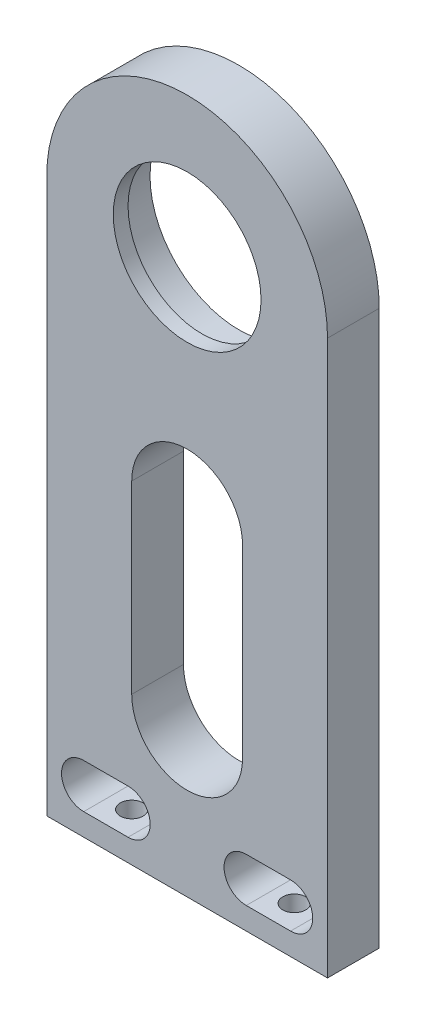
ISO-10303-21;
HEADER;
FILE_DESCRIPTION(('STEP AP214'),'2;1');
FILE_NAME('part.step','',(''),(''),'','','');
FILE_SCHEMA(('AUTOMOTIVE_DESIGN { 1 0 10303 214 1 1 1 1 }'));
ENDSEC;
DATA;
#1=APPLICATION_CONTEXT('core data for automotive mechanical design processes');
#2=APPLICATION_PROTOCOL_DEFINITION('international standard','automotive_design',2000,#1);
#3=PRODUCT_CONTEXT('',#1,'mechanical');
#4=PRODUCT('Part','Part','',(#3));
#5=PRODUCT_RELATED_PRODUCT_CATEGORY('part','',(#4));
#6=PRODUCT_DEFINITION_FORMATION('','',#4);
#7=PRODUCT_DEFINITION_CONTEXT('part definition',#1,'design');
#8=PRODUCT_DEFINITION('design','',#6,#7);
#9=PRODUCT_DEFINITION_SHAPE('','',#8);
#10=(LENGTH_UNIT() NAMED_UNIT(*) SI_UNIT(.MILLI.,.METRE.));
#11=(NAMED_UNIT(*) PLANE_ANGLE_UNIT() SI_UNIT($,.RADIAN.));
#12=(NAMED_UNIT(*) SI_UNIT($,.STERADIAN.) SOLID_ANGLE_UNIT());
#13=UNCERTAINTY_MEASURE_WITH_UNIT(LENGTH_MEASURE(1.E-05),#10,'distance_accuracy_value','');
#14=(GEOMETRIC_REPRESENTATION_CONTEXT(3) GLOBAL_UNCERTAINTY_ASSIGNED_CONTEXT((#13)) GLOBAL_UNIT_ASSIGNED_CONTEXT((#10,
#11,#12)) REPRESENTATION_CONTEXT('',''));
#15=CARTESIAN_POINT('',(0.,0.,0.));
#16=DIRECTION('',(0.,0.,1.));
#17=DIRECTION('',(1.,0.,0.));
#18=AXIS2_PLACEMENT_3D('',#15,#16,#17);
#19=CARTESIAN_POINT('',(0.,75.,7.));
#20=DIRECTION('',(0.,0.,-1.));
#21=DIRECTION('',(-1.,0.,0.));
#22=AXIS2_PLACEMENT_3D('',#19,#20,#21);
#23=CYLINDRICAL_SURFACE('',#22,10.);
#24=CARTESIAN_POINT('',(0.,75.,7.));
#25=DIRECTION('',(0.,0.,1.));
#26=DIRECTION('',(1.,0.,0.));
#27=AXIS2_PLACEMENT_3D('',#24,#25,#26);
#28=CIRCLE('',#27,10.);
#29=CARTESIAN_POINT('',(10.,75.,7.));
#30=VERTEX_POINT('',#29);
#31=EDGE_CURVE('E176',#30,#30,#28,.T.);
#32=ORIENTED_EDGE('',*,*,#31,.T.);
#33=EDGE_LOOP('',(#32));
#34=FACE_BOUND('',#33,.T.);
#35=CARTESIAN_POINT('',(0.,75.,5.));
#36=DIRECTION('',(0.,0.,-1.));
#37=DIRECTION('',(-1.,0.,0.));
#38=AXIS2_PLACEMENT_3D('',#35,#36,#37);
#39=CIRCLE('',#38,10.);
#40=CARTESIAN_POINT('',(-10.,75.,5.));
#41=VERTEX_POINT('',#40);
#42=EDGE_CURVE('E40',#41,#41,#39,.T.);
#43=ORIENTED_EDGE('',*,*,#42,.T.);
#44=EDGE_LOOP('',(#43));
#45=FACE_BOUND('',#44,.T.);
#46=ADVANCED_FACE('F36',(#34,#45),#23,.F.);
#47=CARTESIAN_POINT('',(0.,9.,7.));
#48=DIRECTION('',(0.,1.,0.));
#49=DIRECTION('',(-1.,0.,0.));
#50=AXIS2_PLACEMENT_3D('',#47,#48,#49);
#51=PLANE('',#50);
#52=DIRECTION('',(1.,0.,0.));
#53=VECTOR('',#52,1.);
#54=CARTESIAN_POINT('',(0.,9.,0.));
#55=LINE('',#54,#53);
#56=CARTESIAN_POINT('',(8.,9.,0.));
#57=VERTEX_POINT('',#56);
#58=CARTESIAN_POINT('',(14.,9.,0.));
#59=VERTEX_POINT('',#58);
#60=EDGE_CURVE('E218',#57,#59,#55,.T.);
#61=ORIENTED_EDGE('',*,*,#60,.T.);
#62=DIRECTION('',(0.,0.,-1.));
#63=VECTOR('',#62,1.);
#64=CARTESIAN_POINT('',(14.,9.,7.));
#65=LINE('',#64,#63);
#66=CARTESIAN_POINT('',(14.,9.,7.));
#67=VERTEX_POINT('',#66);
#68=EDGE_CURVE('E11',#67,#59,#65,.T.);
#69=ORIENTED_EDGE('',*,*,#68,.F.);
#70=DIRECTION('',(1.,0.,0.));
#71=VECTOR('',#70,1.);
#72=CARTESIAN_POINT('',(0.,9.,7.));
#73=LINE('',#72,#71);
#74=CARTESIAN_POINT('',(8.,9.,7.));
#75=VERTEX_POINT('',#74);
#76=EDGE_CURVE('E163',#75,#67,#73,.T.);
#77=ORIENTED_EDGE('',*,*,#76,.F.);
#78=DIRECTION('',(0.,0.,-1.));
#79=VECTOR('',#78,1.);
#80=CARTESIAN_POINT('',(8.,9.,7.));
#81=LINE('',#80,#79);
#82=EDGE_CURVE('E226',#75,#57,#81,.T.);
#83=ORIENTED_EDGE('',*,*,#82,.T.);
#84=EDGE_LOOP('',(#61,#69,#77,#83));
#85=FACE_BOUND('',#84,.T.);
#86=ADVANCED_FACE('F322',(#85),#51,.F.);
#87=CARTESIAN_POINT('',(14.,6.,7.));
#88=DIRECTION('',(0.,0.,-1.));
#89=DIRECTION('',(-1.,0.,0.));
#90=AXIS2_PLACEMENT_3D('',#87,#88,#89);
#91=CYLINDRICAL_SURFACE('',#90,3.);
#92=CARTESIAN_POINT('',(14.,6.,0.));
#93=DIRECTION('',(0.,0.,1.));
#94=DIRECTION('',(1.,0.,0.));
#95=AXIS2_PLACEMENT_3D('',#92,#93,#94);
#96=CIRCLE('',#95,3.);
#97=CARTESIAN_POINT('',(14.,3.,0.));
#98=VERTEX_POINT('',#97);
#99=EDGE_CURVE('E169',#59,#98,#96,.F.);
#100=ORIENTED_EDGE('',*,*,#99,.T.);
#101=DIRECTION('',(0.,0.,-1.));
#102=VECTOR('',#101,1.);
#103=CARTESIAN_POINT('',(14.,3.,7.));
#104=LINE('',#103,#102);
#105=CARTESIAN_POINT('',(14.,3.,7.));
#106=VERTEX_POINT('',#105);
#107=EDGE_CURVE('E46',#106,#98,#104,.T.);
#108=ORIENTED_EDGE('',*,*,#107,.F.);
#109=CARTESIAN_POINT('',(14.,6.,7.));
#110=DIRECTION('',(0.,0.,1.));
#111=DIRECTION('',(1.,0.,0.));
#112=AXIS2_PLACEMENT_3D('',#109,#110,#111);
#113=CIRCLE('',#112,3.);
#114=EDGE_CURVE('E156',#67,#106,#113,.F.);
#115=ORIENTED_EDGE('',*,*,#114,.F.);
#116=ORIENTED_EDGE('',*,*,#68,.T.);
#117=EDGE_LOOP('',(#100,#108,#115,#116));
#118=FACE_BOUND('',#117,.T.);
#119=ADVANCED_FACE('F168',(#118),#91,.F.);
#120=CARTESIAN_POINT('',(0.,3.,7.));
#121=DIRECTION('',(0.,1.,0.));
#122=DIRECTION('',(-1.,0.,0.));
#123=AXIS2_PLACEMENT_3D('',#120,#121,#122);
#124=PLANE('',#123);
#125=CARTESIAN_POINT('',(11.,3.,3.5));
#126=DIRECTION('',(0.,1.,0.));
#127=DIRECTION('',(-1.,0.,0.));
#128=AXIS2_PLACEMENT_3D('',#125,#126,#127);
#129=CIRCLE('',#128,1.55);
#130=CARTESIAN_POINT('',(9.45,3.,3.5));
#131=VERTEX_POINT('',#130);
#132=EDGE_CURVE('E366',#131,#131,#129,.T.);
#133=ORIENTED_EDGE('',*,*,#132,.F.);
#134=EDGE_LOOP('',(#133));
#135=FACE_BOUND('',#134,.T.);
#136=DIRECTION('',(1.,0.,0.));
#137=VECTOR('',#136,1.);
#138=CARTESIAN_POINT('',(0.,3.,0.));
#139=LINE('',#138,#137);
#140=CARTESIAN_POINT('',(8.,3.,0.));
#141=VERTEX_POINT('',#140);
#142=EDGE_CURVE('E222',#141,#98,#139,.T.);
#143=ORIENTED_EDGE('',*,*,#142,.F.);
#144=DIRECTION('',(0.,0.,-1.));
#145=VECTOR('',#144,1.);
#146=CARTESIAN_POINT('',(8.,3.,7.));
#147=LINE('',#146,#145);
#148=CARTESIAN_POINT('',(8.,3.,7.));
#149=VERTEX_POINT('',#148);
#150=EDGE_CURVE('E107',#149,#141,#147,.T.);
#151=ORIENTED_EDGE('',*,*,#150,.F.);
#152=DIRECTION('',(1.,0.,0.));
#153=VECTOR('',#152,1.);
#154=CARTESIAN_POINT('',(0.,3.,7.));
#155=LINE('',#154,#153);
#156=EDGE_CURVE('E161',#149,#106,#155,.T.);
#157=ORIENTED_EDGE('',*,*,#156,.T.);
#158=ORIENTED_EDGE('',*,*,#107,.T.);
#159=EDGE_LOOP('',(#143,#151,#157,#158));
#160=FACE_BOUND('',#159,.T.);
#161=ADVANCED_FACE('F174',(#135,#160),#124,.T.);
#162=CARTESIAN_POINT('',(-14.,6.,7.));
#163=DIRECTION('',(0.,0.,-1.));
#164=DIRECTION('',(-1.,0.,0.));
#165=AXIS2_PLACEMENT_3D('',#162,#163,#164);
#166=CYLINDRICAL_SURFACE('',#165,3.);
#167=CARTESIAN_POINT('',(-14.,6.,0.));
#168=DIRECTION('',(0.,0.,1.));
#169=DIRECTION('',(1.,0.,0.));
#170=AXIS2_PLACEMENT_3D('',#167,#168,#169);
#171=CIRCLE('',#170,3.);
#172=CARTESIAN_POINT('',(-14.,9.,0.));
#173=VERTEX_POINT('',#172);
#174=CARTESIAN_POINT('',(-14.,3.,0.));
#175=VERTEX_POINT('',#174);
#176=EDGE_CURVE('E206',#173,#175,#171,.T.);
#177=ORIENTED_EDGE('',*,*,#176,.F.);
#178=DIRECTION('',(0.,0.,-1.));
#179=VECTOR('',#178,1.);
#180=CARTESIAN_POINT('',(-14.,9.,7.));
#181=LINE('',#180,#179);
#182=CARTESIAN_POINT('',(-14.,9.,7.));
#183=VERTEX_POINT('',#182);
#184=EDGE_CURVE('E228',#183,#173,#181,.T.);
#185=ORIENTED_EDGE('',*,*,#184,.F.);
#186=CARTESIAN_POINT('',(-14.,6.,7.));
#187=DIRECTION('',(0.,0.,1.));
#188=DIRECTION('',(1.,0.,0.));
#189=AXIS2_PLACEMENT_3D('',#186,#187,#188);
#190=CIRCLE('',#189,3.);
#191=CARTESIAN_POINT('',(-14.,3.,7.));
#192=VERTEX_POINT('',#191);
#193=EDGE_CURVE('E286',#183,#192,#190,.T.);
#194=ORIENTED_EDGE('',*,*,#193,.T.);
#195=DIRECTION('',(0.,0.,-1.));
#196=VECTOR('',#195,1.);
#197=CARTESIAN_POINT('',(-14.,3.,7.));
#198=LINE('',#197,#196);
#199=EDGE_CURVE('E230',#192,#175,#198,.T.);
#200=ORIENTED_EDGE('',*,*,#199,.T.);
#201=EDGE_LOOP('',(#177,#185,#194,#200));
#202=FACE_BOUND('',#201,.T.);
#203=ADVANCED_FACE('F307',(#202),#166,.F.);
#204=CARTESIAN_POINT('',(0.,9.,7.));
#205=DIRECTION('',(0.,-1.,0.));
#206=DIRECTION('',(1.,0.,0.));
#207=AXIS2_PLACEMENT_3D('',#204,#205,#206);
#208=PLANE('',#207);
#209=DIRECTION('',(-1.,0.,0.));
#210=VECTOR('',#209,1.);
#211=CARTESIAN_POINT('',(0.,9.,0.));
#212=LINE('',#211,#210);
#213=CARTESIAN_POINT('',(-8.,9.,0.));
#214=VERTEX_POINT('',#213);
#215=EDGE_CURVE('E209',#214,#173,#212,.T.);
#216=ORIENTED_EDGE('',*,*,#215,.F.);
#217=DIRECTION('',(0.,0.,-1.));
#218=VECTOR('',#217,1.);
#219=CARTESIAN_POINT('',(-8.,9.,7.));
#220=LINE('',#219,#218);
#221=CARTESIAN_POINT('',(-8.,9.,7.));
#222=VERTEX_POINT('',#221);
#223=EDGE_CURVE('E235',#222,#214,#220,.T.);
#224=ORIENTED_EDGE('',*,*,#223,.F.);
#225=DIRECTION('',(-1.,0.,0.));
#226=VECTOR('',#225,1.);
#227=CARTESIAN_POINT('',(0.,9.,7.));
#228=LINE('',#227,#226);
#229=EDGE_CURVE('E289',#222,#183,#228,.T.);
#230=ORIENTED_EDGE('',*,*,#229,.T.);
#231=ORIENTED_EDGE('',*,*,#184,.T.);
#232=EDGE_LOOP('',(#216,#224,#230,#231));
#233=FACE_BOUND('',#232,.T.);
#234=ADVANCED_FACE('F310',(#233),#208,.T.);
#235=CARTESIAN_POINT('',(-8.,6.,7.));
#236=DIRECTION('',(0.,0.,-1.));
#237=DIRECTION('',(-1.,0.,0.));
#238=AXIS2_PLACEMENT_3D('',#235,#236,#237);
#239=CYLINDRICAL_SURFACE('',#238,3.);
#240=CARTESIAN_POINT('',(-8.,6.,0.));
#241=DIRECTION('',(0.,0.,1.));
#242=DIRECTION('',(1.,0.,0.));
#243=AXIS2_PLACEMENT_3D('',#240,#241,#242);
#244=CIRCLE('',#243,3.);
#245=CARTESIAN_POINT('',(-8.,3.,0.));
#246=VERTEX_POINT('',#245);
#247=EDGE_CURVE('E212',#246,#214,#244,.T.);
#248=ORIENTED_EDGE('',*,*,#247,.F.);
#249=DIRECTION('',(0.,0.,-1.));
#250=VECTOR('',#249,1.);
#251=CARTESIAN_POINT('',(-8.,3.,7.));
#252=LINE('',#251,#250);
#253=CARTESIAN_POINT('',(-8.,3.,7.));
#254=VERTEX_POINT('',#253);
#255=EDGE_CURVE('E232',#254,#246,#252,.T.);
#256=ORIENTED_EDGE('',*,*,#255,.F.);
#257=CARTESIAN_POINT('',(-8.,6.,7.));
#258=DIRECTION('',(0.,0.,1.));
#259=DIRECTION('',(1.,0.,0.));
#260=AXIS2_PLACEMENT_3D('',#257,#258,#259);
#261=CIRCLE('',#260,3.);
#262=EDGE_CURVE('E292',#254,#222,#261,.T.);
#263=ORIENTED_EDGE('',*,*,#262,.T.);
#264=ORIENTED_EDGE('',*,*,#223,.T.);
#265=EDGE_LOOP('',(#248,#256,#263,#264));
#266=FACE_BOUND('',#265,.T.);
#267=ADVANCED_FACE('F313',(#266),#239,.F.);
#268=CARTESIAN_POINT('',(0.,20.,7.));
#269=DIRECTION('',(0.,0.,-1.));
#270=DIRECTION('',(-1.,0.,0.));
#271=AXIS2_PLACEMENT_3D('',#268,#269,#270);
#272=CYLINDRICAL_SURFACE('',#271,7.5);
#273=CARTESIAN_POINT('',(0.,20.,0.));
#274=DIRECTION('',(0.,0.,1.));
#275=DIRECTION('',(1.,0.,0.));
#276=AXIS2_PLACEMENT_3D('',#273,#274,#275);
#277=CIRCLE('',#276,7.5);
#278=CARTESIAN_POINT('',(-7.5,20.,0.));
#279=VERTEX_POINT('',#278);
#280=CARTESIAN_POINT('',(7.5,20.,0.));
#281=VERTEX_POINT('',#280);
#282=EDGE_CURVE('E194',#279,#281,#277,.T.);
#283=ORIENTED_EDGE('',*,*,#282,.F.);
#284=DIRECTION('',(0.,0.,-1.));
#285=VECTOR('',#284,1.);
#286=CARTESIAN_POINT('',(-7.5,20.,7.));
#287=LINE('',#286,#285);
#288=CARTESIAN_POINT('',(-7.5,20.,7.));
#289=VERTEX_POINT('',#288);
#290=EDGE_CURVE('E233',#289,#279,#287,.T.);
#291=ORIENTED_EDGE('',*,*,#290,.F.);
#292=CARTESIAN_POINT('',(0.,20.,7.));
#293=DIRECTION('',(0.,0.,1.));
#294=DIRECTION('',(1.,0.,0.));
#295=AXIS2_PLACEMENT_3D('',#292,#293,#294);
#296=CIRCLE('',#295,7.5);
#297=CARTESIAN_POINT('',(7.5,20.,7.));
#298=VERTEX_POINT('',#297);
#299=EDGE_CURVE('E271',#289,#298,#296,.T.);
#300=ORIENTED_EDGE('',*,*,#299,.T.);
#301=DIRECTION('',(0.,0.,-1.));
#302=VECTOR('',#301,1.);
#303=CARTESIAN_POINT('',(7.5,20.,7.));
#304=LINE('',#303,#302);
#305=EDGE_CURVE('E238',#298,#281,#304,.T.);
#306=ORIENTED_EDGE('',*,*,#305,.T.);
#307=EDGE_LOOP('',(#283,#291,#300,#306));
#308=FACE_BOUND('',#307,.T.);
#309=ADVANCED_FACE('F396',(#308),#272,.F.);
#310=CARTESIAN_POINT('',(-7.5,0.,7.));
#311=DIRECTION('',(1.,0.,0.));
#312=DIRECTION('',(0.,1.,0.));
#313=AXIS2_PLACEMENT_3D('',#310,#311,#312);
#314=PLANE('',#313);
#315=DIRECTION('',(0.,-1.,0.));
#316=VECTOR('',#315,1.);
#317=CARTESIAN_POINT('',(-7.5,0.,0.));
#318=LINE('',#317,#316);
#319=CARTESIAN_POINT('',(-7.5,45.,0.));
#320=VERTEX_POINT('',#319);
#321=EDGE_CURVE('E197',#320,#279,#318,.T.);
#322=ORIENTED_EDGE('',*,*,#321,.F.);
#323=DIRECTION('',(0.,0.,-1.));
#324=VECTOR('',#323,1.);
#325=CARTESIAN_POINT('',(-7.5,45.,7.));
#326=LINE('',#325,#324);
#327=CARTESIAN_POINT('',(-7.5,45.,7.));
#328=VERTEX_POINT('',#327);
#329=EDGE_CURVE('E243',#328,#320,#326,.T.);
#330=ORIENTED_EDGE('',*,*,#329,.F.);
#331=DIRECTION('',(0.,-1.,0.));
#332=VECTOR('',#331,1.);
#333=CARTESIAN_POINT('',(-7.5,0.,7.));
#334=LINE('',#333,#332);
#335=EDGE_CURVE('E278',#328,#289,#334,.T.);
#336=ORIENTED_EDGE('',*,*,#335,.T.);
#337=ORIENTED_EDGE('',*,*,#290,.T.);
#338=EDGE_LOOP('',(#322,#330,#336,#337));
#339=FACE_BOUND('',#338,.T.);
#340=ADVANCED_FACE('F406',(#339),#314,.T.);
#341=CARTESIAN_POINT('',(0.,45.,7.));
#342=DIRECTION('',(0.,0.,-1.));
#343=DIRECTION('',(-1.,0.,0.));
#344=AXIS2_PLACEMENT_3D('',#341,#342,#343);
#345=CYLINDRICAL_SURFACE('',#344,7.5);
#346=CARTESIAN_POINT('',(0.,45.,0.));
#347=DIRECTION('',(0.,0.,1.));
#348=DIRECTION('',(1.,0.,0.));
#349=AXIS2_PLACEMENT_3D('',#346,#347,#348);
#350=CIRCLE('',#349,7.5);
#351=CARTESIAN_POINT('',(7.5,45.,0.));
#352=VERTEX_POINT('',#351);
#353=EDGE_CURVE('E200',#352,#320,#350,.T.);
#354=ORIENTED_EDGE('',*,*,#353,.F.);
#355=DIRECTION('',(0.,0.,-1.));
#356=VECTOR('',#355,1.);
#357=CARTESIAN_POINT('',(7.5,45.,7.));
#358=LINE('',#357,#356);
#359=CARTESIAN_POINT('',(7.5,45.,7.));
#360=VERTEX_POINT('',#359);
#361=EDGE_CURVE('E240',#360,#352,#358,.T.);
#362=ORIENTED_EDGE('',*,*,#361,.F.);
#363=CARTESIAN_POINT('',(0.,45.,7.));
#364=DIRECTION('',(0.,0.,1.));
#365=DIRECTION('',(1.,0.,0.));
#366=AXIS2_PLACEMENT_3D('',#363,#364,#365);
#367=CIRCLE('',#366,7.5);
#368=EDGE_CURVE('E281',#360,#328,#367,.T.);
#369=ORIENTED_EDGE('',*,*,#368,.T.);
#370=ORIENTED_EDGE('',*,*,#329,.T.);
#371=EDGE_LOOP('',(#354,#362,#369,#370));
#372=FACE_BOUND('',#371,.T.);
#373=ADVANCED_FACE('F402',(#372),#345,.F.);
#374=CARTESIAN_POINT('',(19.,0.,7.));
#375=DIRECTION('',(-1.,0.,0.));
#376=DIRECTION('',(0.,0.,1.));
#377=AXIS2_PLACEMENT_3D('',#374,#375,#376);
#378=PLANE('',#377);
#379=DIRECTION('',(0.,1.,0.));
#380=VECTOR('',#379,1.);
#381=CARTESIAN_POINT('',(19.,0.,0.));
#382=LINE('',#381,#380);
#383=CARTESIAN_POINT('',(19.,0.,0.));
#384=VERTEX_POINT('',#383);
#385=CARTESIAN_POINT('',(19.,75.,0.));
#386=VERTEX_POINT('',#385);
#387=EDGE_CURVE('E183',#384,#386,#382,.T.);
#388=ORIENTED_EDGE('',*,*,#387,.T.);
#389=DIRECTION('',(0.,0.,-1.));
#390=VECTOR('',#389,1.);
#391=CARTESIAN_POINT('',(19.,75.,7.));
#392=LINE('',#391,#390);
#393=CARTESIAN_POINT('',(19.,75.,7.));
#394=VERTEX_POINT('',#393);
#395=EDGE_CURVE('E241',#394,#386,#392,.T.);
#396=ORIENTED_EDGE('',*,*,#395,.F.);
#397=DIRECTION('',(0.,1.,0.));
#398=VECTOR('',#397,1.);
#399=CARTESIAN_POINT('',(19.,0.,7.));
#400=LINE('',#399,#398);
#401=CARTESIAN_POINT('',(19.,0.,7.));
#402=VERTEX_POINT('',#401);
#403=EDGE_CURVE('E225',#402,#394,#400,.T.);
#404=ORIENTED_EDGE('',*,*,#403,.F.);
#405=DIRECTION('',(0.,0.,-1.));
#406=VECTOR('',#405,1.);
#407=CARTESIAN_POINT('',(19.,0.,7.));
#408=LINE('',#407,#406);
#409=EDGE_CURVE('E182',#402,#384,#408,.T.);
#410=ORIENTED_EDGE('',*,*,#409,.T.);
#411=EDGE_LOOP('',(#388,#396,#404,#410));
#412=FACE_BOUND('',#411,.T.);
#413=ADVANCED_FACE('F38',(#412),#378,.F.);
#414=CARTESIAN_POINT('',(0.,75.,7.));
#415=DIRECTION('',(0.,0.,-1.));
#416=DIRECTION('',(-1.,0.,0.));
#417=AXIS2_PLACEMENT_3D('',#414,#415,#416);
#418=CYLINDRICAL_SURFACE('',#417,19.);
#419=CARTESIAN_POINT('',(0.,75.,0.));
#420=DIRECTION('',(0.,0.,1.));
#421=DIRECTION('',(1.,0.,0.));
#422=AXIS2_PLACEMENT_3D('',#419,#420,#421);
#423=CIRCLE('',#422,19.);
#424=CARTESIAN_POINT('',(-19.,75.,0.));
#425=VERTEX_POINT('',#424);
#426=EDGE_CURVE('E186',#386,#425,#423,.T.);
#427=ORIENTED_EDGE('',*,*,#426,.T.);
#428=DIRECTION('',(0.,0.,-1.));
#429=VECTOR('',#428,1.);
#430=CARTESIAN_POINT('',(-19.,75.,7.));
#431=LINE('',#430,#429);
#432=CARTESIAN_POINT('',(-19.,75.,7.));
#433=VERTEX_POINT('',#432);
#434=EDGE_CURVE('E250',#433,#425,#431,.T.);
#435=ORIENTED_EDGE('',*,*,#434,.F.);
#436=CARTESIAN_POINT('',(0.,75.,7.));
#437=DIRECTION('',(0.,0.,1.));
#438=DIRECTION('',(1.,0.,0.));
#439=AXIS2_PLACEMENT_3D('',#436,#437,#438);
#440=CIRCLE('',#439,19.);
#441=EDGE_CURVE('E119',#394,#433,#440,.T.);
#442=ORIENTED_EDGE('',*,*,#441,.F.);
#443=ORIENTED_EDGE('',*,*,#395,.T.);
#444=EDGE_LOOP('',(#427,#435,#442,#443));
#445=FACE_BOUND('',#444,.T.);
#446=ADVANCED_FACE('F252',(#445),#418,.T.);
#447=CARTESIAN_POINT('',(-19.,0.,7.));
#448=DIRECTION('',(-1.,0.,0.));
#449=DIRECTION('',(0.,0.,1.));
#450=AXIS2_PLACEMENT_3D('',#447,#448,#449);
#451=PLANE('',#450);
#452=DIRECTION('',(0.,1.,0.));
#453=VECTOR('',#452,1.);
#454=CARTESIAN_POINT('',(-19.,0.,0.));
#455=LINE('',#454,#453);
#456=CARTESIAN_POINT('',(-19.,0.,0.));
#457=VERTEX_POINT('',#456);
#458=EDGE_CURVE('E189',#457,#425,#455,.T.);
#459=ORIENTED_EDGE('',*,*,#458,.F.);
#460=DIRECTION('',(0.,0.,-1.));
#461=VECTOR('',#460,1.);
#462=CARTESIAN_POINT('',(-19.,0.,7.));
#463=LINE('',#462,#461);
#464=CARTESIAN_POINT('',(-19.,0.,7.));
#465=VERTEX_POINT('',#464);
#466=EDGE_CURVE('E248',#465,#457,#463,.T.);
#467=ORIENTED_EDGE('',*,*,#466,.F.);
#468=DIRECTION('',(0.,1.,0.));
#469=VECTOR('',#468,1.);
#470=CARTESIAN_POINT('',(-19.,0.,7.));
#471=LINE('',#470,#469);
#472=EDGE_CURVE('E267',#465,#433,#471,.T.);
#473=ORIENTED_EDGE('',*,*,#472,.T.);
#474=ORIENTED_EDGE('',*,*,#434,.T.);
#475=EDGE_LOOP('',(#459,#467,#473,#474));
#476=FACE_BOUND('',#475,.T.);
#477=ADVANCED_FACE('F263',(#476),#451,.T.);
#478=CARTESIAN_POINT('',(8.,6.,7.));
#479=DIRECTION('',(0.,0.,-1.));
#480=DIRECTION('',(-1.,0.,0.));
#481=AXIS2_PLACEMENT_3D('',#478,#479,#480);
#482=CYLINDRICAL_SURFACE('',#481,3.);
#483=CARTESIAN_POINT('',(8.,6.,0.));
#484=DIRECTION('',(0.,0.,1.));
#485=DIRECTION('',(1.,0.,0.));
#486=AXIS2_PLACEMENT_3D('',#483,#484,#485);
#487=CIRCLE('',#486,3.);
#488=EDGE_CURVE('E110',#141,#57,#487,.F.);
#489=ORIENTED_EDGE('',*,*,#488,.T.);
#490=ORIENTED_EDGE('',*,*,#82,.F.);
#491=CARTESIAN_POINT('',(8.,6.,7.));
#492=DIRECTION('',(0.,0.,1.));
#493=DIRECTION('',(1.,0.,0.));
#494=AXIS2_PLACEMENT_3D('',#491,#492,#493);
#495=CIRCLE('',#494,3.);
#496=EDGE_CURVE('E55',#149,#75,#495,.F.);
#497=ORIENTED_EDGE('',*,*,#496,.F.);
#498=ORIENTED_EDGE('',*,*,#150,.T.);
#499=EDGE_LOOP('',(#489,#490,#497,#498));
#500=FACE_BOUND('',#499,.T.);
#501=ADVANCED_FACE('F323',(#500),#482,.F.);
#502=CARTESIAN_POINT('',(0.,3.,7.));
#503=DIRECTION('',(0.,-1.,0.));
#504=DIRECTION('',(1.,0.,0.));
#505=AXIS2_PLACEMENT_3D('',#502,#503,#504);
#506=PLANE('',#505);
#507=CARTESIAN_POINT('',(-11.,3.,3.5));
#508=DIRECTION('',(0.,-1.,0.));
#509=DIRECTION('',(1.,0.,0.));
#510=AXIS2_PLACEMENT_3D('',#507,#508,#509);
#511=CIRCLE('',#510,1.55);
#512=CARTESIAN_POINT('',(-9.45,3.,3.5));
#513=VERTEX_POINT('',#512);
#514=EDGE_CURVE('E371',#513,#513,#511,.T.);
#515=ORIENTED_EDGE('',*,*,#514,.T.);
#516=EDGE_LOOP('',(#515));
#517=FACE_BOUND('',#516,.T.);
#518=DIRECTION('',(-1.,0.,0.));
#519=VECTOR('',#518,1.);
#520=CARTESIAN_POINT('',(0.,3.,0.));
#521=LINE('',#520,#519);
#522=EDGE_CURVE('E215',#246,#175,#521,.T.);
#523=ORIENTED_EDGE('',*,*,#522,.T.);
#524=ORIENTED_EDGE('',*,*,#199,.F.);
#525=DIRECTION('',(-1.,0.,0.));
#526=VECTOR('',#525,1.);
#527=CARTESIAN_POINT('',(0.,3.,7.));
#528=LINE('',#527,#526);
#529=EDGE_CURVE('E295',#254,#192,#528,.T.);
#530=ORIENTED_EDGE('',*,*,#529,.F.);
#531=ORIENTED_EDGE('',*,*,#255,.T.);
#532=EDGE_LOOP('',(#523,#524,#530,#531));
#533=FACE_BOUND('',#532,.T.);
#534=ADVANCED_FACE('F303',(#517,#533),#506,.F.);
#535=CARTESIAN_POINT('',(7.50000000000001,0.,7.));
#536=DIRECTION('',(1.,0.,0.));
#537=DIRECTION('',(0.,1.,0.));
#538=AXIS2_PLACEMENT_3D('',#535,#536,#537);
#539=PLANE('',#538);
#540=DIRECTION('',(0.,-1.,0.));
#541=VECTOR('',#540,1.);
#542=CARTESIAN_POINT('',(7.50000000000001,0.,0.));
#543=LINE('',#542,#541);
#544=EDGE_CURVE('E203',#352,#281,#543,.T.);
#545=ORIENTED_EDGE('',*,*,#544,.T.);
#546=ORIENTED_EDGE('',*,*,#305,.F.);
#547=DIRECTION('',(0.,-1.,0.));
#548=VECTOR('',#547,1.);
#549=CARTESIAN_POINT('',(7.50000000000001,0.,7.));
#550=LINE('',#549,#548);
#551=EDGE_CURVE('E284',#360,#298,#550,.T.);
#552=ORIENTED_EDGE('',*,*,#551,.F.);
#553=ORIENTED_EDGE('',*,*,#361,.T.);
#554=EDGE_LOOP('',(#545,#546,#552,#553));
#555=FACE_BOUND('',#554,.T.);
#556=ADVANCED_FACE('F330',(#555),#539,.F.);
#557=CARTESIAN_POINT('',(0.,0.,7.));
#558=DIRECTION('',(0.,1.,0.));
#559=DIRECTION('',(0.,0.,1.));
#560=AXIS2_PLACEMENT_3D('',#557,#558,#559);
#561=PLANE('',#560);
#562=CARTESIAN_POINT('',(11.,0.,3.5));
#563=DIRECTION('',(0.,-1.,0.));
#564=DIRECTION('',(0.,0.,-1.));
#565=AXIS2_PLACEMENT_3D('',#562,#563,#564);
#566=CIRCLE('',#565,1.55);
#567=CARTESIAN_POINT('',(11.,0.,1.95));
#568=VERTEX_POINT('',#567);
#569=EDGE_CURVE('E369',#568,#568,#566,.T.);
#570=ORIENTED_EDGE('',*,*,#569,.F.);
#571=EDGE_LOOP('',(#570));
#572=FACE_BOUND('',#571,.T.);
#573=CARTESIAN_POINT('',(-11.,0.,3.5));
#574=DIRECTION('',(0.,-1.,0.));
#575=DIRECTION('',(0.,0.,1.));
#576=AXIS2_PLACEMENT_3D('',#573,#574,#575);
#577=CIRCLE('',#576,1.55);
#578=CARTESIAN_POINT('',(-11.,0.,5.05));
#579=VERTEX_POINT('',#578);
#580=EDGE_CURVE('E372',#579,#579,#577,.T.);
#581=ORIENTED_EDGE('',*,*,#580,.F.);
#582=EDGE_LOOP('',(#581));
#583=FACE_BOUND('',#582,.T.);
#584=DIRECTION('',(1.,0.,0.));
#585=VECTOR('',#584,1.);
#586=CARTESIAN_POINT('',(0.,0.,0.));
#587=LINE('',#586,#585);
#588=EDGE_CURVE('E192',#457,#384,#587,.T.);
#589=ORIENTED_EDGE('',*,*,#588,.T.);
#590=ORIENTED_EDGE('',*,*,#409,.F.);
#591=DIRECTION('',(1.,0.,0.));
#592=VECTOR('',#591,1.);
#593=CARTESIAN_POINT('',(0.,0.,7.));
#594=LINE('',#593,#592);
#595=EDGE_CURVE('E269',#465,#402,#594,.T.);
#596=ORIENTED_EDGE('',*,*,#595,.F.);
#597=ORIENTED_EDGE('',*,*,#466,.T.);
#598=EDGE_LOOP('',(#589,#590,#596,#597));
#599=FACE_BOUND('',#598,.T.);
#600=ADVANCED_FACE('F346',(#572,#583,#599),#561,.F.);
#601=CARTESIAN_POINT('',(0.,0.,7.));
#602=DIRECTION('',(0.,0.,1.));
#603=DIRECTION('',(1.,0.,0.));
#604=AXIS2_PLACEMENT_3D('',#601,#602,#603);
#605=PLANE('',#604);
#606=ORIENTED_EDGE('',*,*,#403,.T.);
#607=ORIENTED_EDGE('',*,*,#441,.T.);
#608=ORIENTED_EDGE('',*,*,#472,.F.);
#609=ORIENTED_EDGE('',*,*,#595,.T.);
#610=EDGE_LOOP('',(#606,#607,#608,#609));
#611=FACE_BOUND('',#610,.T.);
#612=ORIENTED_EDGE('',*,*,#299,.F.);
#613=ORIENTED_EDGE('',*,*,#335,.F.);
#614=ORIENTED_EDGE('',*,*,#368,.F.);
#615=ORIENTED_EDGE('',*,*,#551,.T.);
#616=EDGE_LOOP('',(#612,#613,#614,#615));
#617=FACE_BOUND('',#616,.T.);
#618=ORIENTED_EDGE('',*,*,#193,.F.);
#619=ORIENTED_EDGE('',*,*,#229,.F.);
#620=ORIENTED_EDGE('',*,*,#262,.F.);
#621=ORIENTED_EDGE('',*,*,#529,.T.);
#622=EDGE_LOOP('',(#618,#619,#620,#621));
#623=FACE_BOUND('',#622,.T.);
#624=ORIENTED_EDGE('',*,*,#76,.T.);
#625=ORIENTED_EDGE('',*,*,#114,.T.);
#626=ORIENTED_EDGE('',*,*,#156,.F.);
#627=ORIENTED_EDGE('',*,*,#496,.T.);
#628=EDGE_LOOP('',(#624,#625,#626,#627));
#629=FACE_BOUND('',#628,.T.);
#630=ORIENTED_EDGE('',*,*,#31,.F.);
#631=EDGE_LOOP('',(#630));
#632=FACE_BOUND('',#631,.T.);
#633=ADVANCED_FACE('F158',(#611,#617,#623,#629,#632),#605,.T.);
#634=CARTESIAN_POINT('',(0.,0.,0.));
#635=DIRECTION('',(0.,0.,1.));
#636=DIRECTION('',(1.,0.,0.));
#637=AXIS2_PLACEMENT_3D('',#634,#635,#636);
#638=PLANE('',#637);
#639=CARTESIAN_POINT('',(0.,75.,0.));
#640=DIRECTION('',(0.,0.,-1.));
#641=DIRECTION('',(-1.,0.,0.));
#642=AXIS2_PLACEMENT_3D('',#639,#640,#641);
#643=CIRCLE('',#642,12.025);
#644=CARTESIAN_POINT('',(-12.025,75.,0.));
#645=VERTEX_POINT('',#644);
#646=EDGE_CURVE('E380',#645,#645,#643,.T.);
#647=ORIENTED_EDGE('',*,*,#646,.F.);
#648=EDGE_LOOP('',(#647));
#649=FACE_BOUND('',#648,.T.);
#650=ORIENTED_EDGE('',*,*,#387,.F.);
#651=ORIENTED_EDGE('',*,*,#588,.F.);
#652=ORIENTED_EDGE('',*,*,#458,.T.);
#653=ORIENTED_EDGE('',*,*,#426,.F.);
#654=EDGE_LOOP('',(#650,#651,#652,#653));
#655=FACE_BOUND('',#654,.T.);
#656=ORIENTED_EDGE('',*,*,#282,.T.);
#657=ORIENTED_EDGE('',*,*,#544,.F.);
#658=ORIENTED_EDGE('',*,*,#353,.T.);
#659=ORIENTED_EDGE('',*,*,#321,.T.);
#660=EDGE_LOOP('',(#656,#657,#658,#659));
#661=FACE_BOUND('',#660,.T.);
#662=ORIENTED_EDGE('',*,*,#176,.T.);
#663=ORIENTED_EDGE('',*,*,#522,.F.);
#664=ORIENTED_EDGE('',*,*,#247,.T.);
#665=ORIENTED_EDGE('',*,*,#215,.T.);
#666=EDGE_LOOP('',(#662,#663,#664,#665));
#667=FACE_BOUND('',#666,.T.);
#668=ORIENTED_EDGE('',*,*,#60,.F.);
#669=ORIENTED_EDGE('',*,*,#488,.F.);
#670=ORIENTED_EDGE('',*,*,#142,.T.);
#671=ORIENTED_EDGE('',*,*,#99,.F.);
#672=EDGE_LOOP('',(#668,#669,#670,#671));
#673=FACE_BOUND('',#672,.T.);
#674=ADVANCED_FACE('F259',(#649,#655,#661,#667,#673),#638,.F.);
#675=CARTESIAN_POINT('',(0.,75.,5.));
#676=DIRECTION('',(0.,0.,-1.));
#677=DIRECTION('',(-1.,0.,0.));
#678=AXIS2_PLACEMENT_3D('',#675,#676,#677);
#679=CYLINDRICAL_SURFACE('',#678,12.025);
#680=CARTESIAN_POINT('',(0.,75.,5.));
#681=DIRECTION('',(0.,0.,-1.));
#682=DIRECTION('',(-1.,0.,0.));
#683=AXIS2_PLACEMENT_3D('',#680,#681,#682);
#684=CIRCLE('',#683,12.025);
#685=CARTESIAN_POINT('',(-12.025,75.,5.));
#686=VERTEX_POINT('',#685);
#687=EDGE_CURVE('E381',#686,#686,#684,.T.);
#688=ORIENTED_EDGE('',*,*,#687,.F.);
#689=EDGE_LOOP('',(#688));
#690=FACE_BOUND('',#689,.T.);
#691=ORIENTED_EDGE('',*,*,#646,.T.);
#692=EDGE_LOOP('',(#691));
#693=FACE_BOUND('',#692,.T.);
#694=ADVANCED_FACE('F317',(#690,#693),#679,.F.);
#695=CARTESIAN_POINT('',(0.,75.,5.));
#696=DIRECTION('',(0.,0.,-1.));
#697=DIRECTION('',(-1.,0.,0.));
#698=AXIS2_PLACEMENT_3D('',#695,#696,#697);
#699=PLANE('',#698);
#700=ORIENTED_EDGE('',*,*,#42,.F.);
#701=EDGE_LOOP('',(#700));
#702=FACE_BOUND('',#701,.T.);
#703=ORIENTED_EDGE('',*,*,#687,.T.);
#704=EDGE_LOOP('',(#703));
#705=FACE_BOUND('',#704,.T.);
#706=ADVANCED_FACE('F349',(#702,#705),#699,.T.);
#707=CARTESIAN_POINT('',(-11.,5.,3.5));
#708=DIRECTION('',(0.,-1.,0.));
#709=DIRECTION('',(0.,0.,-1.));
#710=AXIS2_PLACEMENT_3D('',#707,#708,#709);
#711=CYLINDRICAL_SURFACE('',#710,1.55);
#712=ORIENTED_EDGE('',*,*,#580,.T.);
#713=EDGE_LOOP('',(#712));
#714=FACE_BOUND('',#713,.T.);
#715=ORIENTED_EDGE('',*,*,#514,.F.);
#716=EDGE_LOOP('',(#715));
#717=FACE_BOUND('',#716,.T.);
#718=ADVANCED_FACE('F353',(#714,#717),#711,.F.);
#719=CARTESIAN_POINT('',(11.,5.,3.5));
#720=DIRECTION('',(0.,-1.,0.));
#721=DIRECTION('',(0.,0.,-1.));
#722=AXIS2_PLACEMENT_3D('',#719,#720,#721);
#723=CYLINDRICAL_SURFACE('',#722,1.55);
#724=ORIENTED_EDGE('',*,*,#132,.T.);
#725=EDGE_LOOP('',(#724));
#726=FACE_BOUND('',#725,.T.);
#727=ORIENTED_EDGE('',*,*,#569,.T.);
#728=EDGE_LOOP('',(#727));
#729=FACE_BOUND('',#728,.T.);
#730=ADVANCED_FACE('F357',(#726,#729),#723,.F.);
#731=CLOSED_SHELL('',(#46,#86,#119,#161,#203,#234,#267,#309,#340,#373,#413,#446,#477,#501,#534,
#556,#600,#633,#674,#694,#706,#718,#730));
#732=MANIFOLD_SOLID_BREP('B2',#731);
#733=ADVANCED_BREP_SHAPE_REPRESENTATION('',(#18,#732),#14);
#734=SHAPE_DEFINITION_REPRESENTATION(#9,#733);
ENDSEC;
END-ISO-10303-21;
